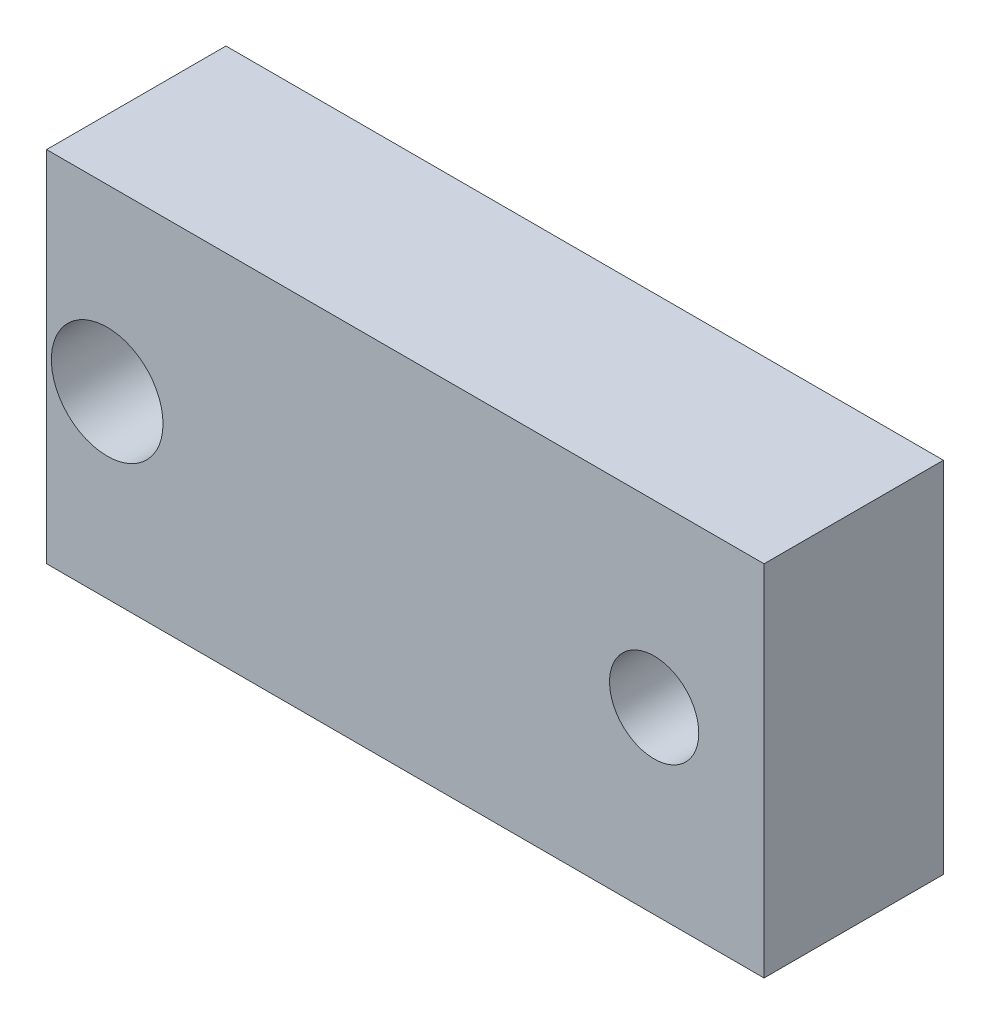
ISO-10303-21;
HEADER;
FILE_DESCRIPTION(('STEP AP214'),'2;1');
FILE_NAME('part.step','',(''),(''),'','','');
FILE_SCHEMA(('AUTOMOTIVE_DESIGN { 1 0 10303 214 1 1 1 1 }'));
ENDSEC;
DATA;
#1=APPLICATION_CONTEXT('core data for automotive mechanical design processes');
#2=APPLICATION_PROTOCOL_DEFINITION('international standard','automotive_design',2000,#1);
#3=PRODUCT_CONTEXT('',#1,'mechanical');
#4=PRODUCT('Part','Part','',(#3));
#5=PRODUCT_RELATED_PRODUCT_CATEGORY('part','',(#4));
#6=PRODUCT_DEFINITION_FORMATION('','',#4);
#7=PRODUCT_DEFINITION_CONTEXT('part definition',#1,'design');
#8=PRODUCT_DEFINITION('design','',#6,#7);
#9=PRODUCT_DEFINITION_SHAPE('','',#8);
#10=(LENGTH_UNIT() NAMED_UNIT(*) SI_UNIT(.MILLI.,.METRE.));
#11=(NAMED_UNIT(*) PLANE_ANGLE_UNIT() SI_UNIT($,.RADIAN.));
#12=(NAMED_UNIT(*) SI_UNIT($,.STERADIAN.) SOLID_ANGLE_UNIT());
#13=UNCERTAINTY_MEASURE_WITH_UNIT(LENGTH_MEASURE(1.E-05),#10,'distance_accuracy_value','');
#14=(GEOMETRIC_REPRESENTATION_CONTEXT(3) GLOBAL_UNCERTAINTY_ASSIGNED_CONTEXT((#13)) GLOBAL_UNIT_ASSIGNED_CONTEXT((#10,
#11,#12)) REPRESENTATION_CONTEXT('',''));
#15=CARTESIAN_POINT('',(0.,0.,0.));
#16=DIRECTION('',(0.,0.,1.));
#17=DIRECTION('',(1.,0.,0.));
#18=AXIS2_PLACEMENT_3D('',#15,#16,#17);
#19=CARTESIAN_POINT('',(0.,0.,6.35));
#20=DIRECTION('',(0.,0.,-1.));
#21=DIRECTION('',(-1.,0.,0.));
#22=AXIS2_PLACEMENT_3D('',#19,#20,#21);
#23=PLANE('',#22);
#24=DIRECTION('',(0.,1.,0.));
#25=VECTOR('',#24,1.);
#26=CARTESIAN_POINT('',(12.7,-6.35,6.35));
#27=LINE('',#26,#25);
#28=CARTESIAN_POINT('',(12.7,-6.35,6.35));
#29=VERTEX_POINT('',#28);
#30=CARTESIAN_POINT('',(12.7,6.35,6.35));
#31=VERTEX_POINT('',#30);
#32=EDGE_CURVE('E96',#29,#31,#27,.T.);
#33=ORIENTED_EDGE('',*,*,#32,.T.);
#34=DIRECTION('',(-1.,0.,0.));
#35=VECTOR('',#34,1.);
#36=CARTESIAN_POINT('',(-12.7,6.35,6.35));
#37=LINE('',#36,#35);
#38=CARTESIAN_POINT('',(-12.7,6.35,6.35));
#39=VERTEX_POINT('',#38);
#40=EDGE_CURVE('E91',#31,#39,#37,.T.);
#41=ORIENTED_EDGE('',*,*,#40,.T.);
#42=DIRECTION('',(0.,-1.,0.));
#43=VECTOR('',#42,1.);
#44=CARTESIAN_POINT('',(-12.7,-6.35,6.35));
#45=LINE('',#44,#43);
#46=CARTESIAN_POINT('',(-12.7,-6.35,6.35));
#47=VERTEX_POINT('',#46);
#48=EDGE_CURVE('E94',#39,#47,#45,.T.);
#49=ORIENTED_EDGE('',*,*,#48,.T.);
#50=DIRECTION('',(1.,0.,0.));
#51=VECTOR('',#50,1.);
#52=CARTESIAN_POINT('',(-12.7,-6.35,6.35));
#53=LINE('',#52,#51);
#54=EDGE_CURVE('E61',#47,#29,#53,.T.);
#55=ORIENTED_EDGE('',*,*,#54,.T.);
#56=EDGE_LOOP('',(#33,#41,#49,#55));
#57=FACE_BOUND('',#56,.T.);
#58=CARTESIAN_POINT('',(-10.5551832513173,0.,6.35));
#59=DIRECTION('',(0.,0.,1.));
#60=DIRECTION('',(1.,0.,0.));
#61=AXIS2_PLACEMENT_3D('',#58,#59,#60);
#62=CIRCLE('',#61,1.97613137361897);
#63=CARTESIAN_POINT('',(-8.57905187769831,0.,6.35));
#64=VERTEX_POINT('',#63);
#65=EDGE_CURVE('E116',#64,#64,#62,.T.);
#66=ORIENTED_EDGE('',*,*,#65,.F.);
#67=EDGE_LOOP('',(#66));
#68=FACE_BOUND('',#67,.T.);
#69=CARTESIAN_POINT('',(8.80921308944525,0.,6.35));
#70=DIRECTION('',(0.,0.,1.));
#71=DIRECTION('',(1.,0.,0.));
#72=AXIS2_PLACEMENT_3D('',#69,#70,#71);
#73=CIRCLE('',#72,1.57931997319352);
#74=CARTESIAN_POINT('',(10.3885330626388,0.,6.35));
#75=VERTEX_POINT('',#74);
#76=EDGE_CURVE('E138',#75,#75,#73,.T.);
#77=ORIENTED_EDGE('',*,*,#76,.F.);
#78=EDGE_LOOP('',(#77));
#79=FACE_BOUND('',#78,.T.);
#80=ADVANCED_FACE('F43',(#57,#68,#79),#23,.F.);
#81=CARTESIAN_POINT('',(0.,0.,0.));
#82=DIRECTION('',(0.,0.,-1.));
#83=DIRECTION('',(-1.,0.,0.));
#84=AXIS2_PLACEMENT_3D('',#81,#82,#83);
#85=PLANE('',#84);
#86=CARTESIAN_POINT('',(-10.5551832513173,0.,0.));
#87=DIRECTION('',(0.,0.,1.));
#88=DIRECTION('',(1.,0.,0.));
#89=AXIS2_PLACEMENT_3D('',#86,#87,#88);
#90=CIRCLE('',#89,1.97613137361897);
#91=CARTESIAN_POINT('',(-8.57905187769831,0.,0.));
#92=VERTEX_POINT('',#91);
#93=EDGE_CURVE('E134',#92,#92,#90,.T.);
#94=ORIENTED_EDGE('',*,*,#93,.T.);
#95=EDGE_LOOP('',(#94));
#96=FACE_BOUND('',#95,.T.);
#97=DIRECTION('',(0.,1.,0.));
#98=VECTOR('',#97,1.);
#99=CARTESIAN_POINT('',(12.7,-6.35,0.));
#100=LINE('',#99,#98);
#101=CARTESIAN_POINT('',(12.7,-6.35,0.));
#102=VERTEX_POINT('',#101);
#103=CARTESIAN_POINT('',(12.7,6.35,0.));
#104=VERTEX_POINT('',#103);
#105=EDGE_CURVE('E112',#102,#104,#100,.T.);
#106=ORIENTED_EDGE('',*,*,#105,.F.);
#107=DIRECTION('',(1.,0.,0.));
#108=VECTOR('',#107,1.);
#109=CARTESIAN_POINT('',(-12.7,-6.35,0.));
#110=LINE('',#109,#108);
#111=CARTESIAN_POINT('',(-12.7,-6.35,0.));
#112=VERTEX_POINT('',#111);
#113=EDGE_CURVE('E84',#112,#102,#110,.T.);
#114=ORIENTED_EDGE('',*,*,#113,.F.);
#115=DIRECTION('',(0.,-1.,0.));
#116=VECTOR('',#115,1.);
#117=CARTESIAN_POINT('',(-12.7,-6.35,0.));
#118=LINE('',#117,#116);
#119=CARTESIAN_POINT('',(-12.7,6.35,0.));
#120=VERTEX_POINT('',#119);
#121=EDGE_CURVE('E78',#120,#112,#118,.T.);
#122=ORIENTED_EDGE('',*,*,#121,.F.);
#123=DIRECTION('',(-1.,0.,0.));
#124=VECTOR('',#123,1.);
#125=CARTESIAN_POINT('',(-12.7,6.35,0.));
#126=LINE('',#125,#124);
#127=EDGE_CURVE('E101',#104,#120,#126,.T.);
#128=ORIENTED_EDGE('',*,*,#127,.F.);
#129=EDGE_LOOP('',(#106,#114,#122,#128));
#130=FACE_BOUND('',#129,.T.);
#131=CARTESIAN_POINT('',(8.80921308944525,0.,0.));
#132=DIRECTION('',(0.,0.,1.));
#133=DIRECTION('',(1.,0.,0.));
#134=AXIS2_PLACEMENT_3D('',#131,#132,#133);
#135=CIRCLE('',#134,1.57931997319352);
#136=CARTESIAN_POINT('',(10.3885330626388,0.,0.));
#137=VERTEX_POINT('',#136);
#138=EDGE_CURVE('E142',#137,#137,#135,.T.);
#139=ORIENTED_EDGE('',*,*,#138,.T.);
#140=EDGE_LOOP('',(#139));
#141=FACE_BOUND('',#140,.T.);
#142=ADVANCED_FACE('F129',(#96,#130,#141),#85,.T.);
#143=CARTESIAN_POINT('',(12.7,-6.35,6.35));
#144=DIRECTION('',(-1.,0.,0.));
#145=DIRECTION('',(0.,0.,1.));
#146=AXIS2_PLACEMENT_3D('',#143,#144,#145);
#147=PLANE('',#146);
#148=ORIENTED_EDGE('',*,*,#105,.T.);
#149=DIRECTION('',(0.,0.,-1.));
#150=VECTOR('',#149,1.);
#151=CARTESIAN_POINT('',(12.7,6.35,6.35));
#152=LINE('',#151,#150);
#153=EDGE_CURVE('E11',#31,#104,#152,.T.);
#154=ORIENTED_EDGE('',*,*,#153,.F.);
#155=ORIENTED_EDGE('',*,*,#32,.F.);
#156=DIRECTION('',(0.,0.,-1.));
#157=VECTOR('',#156,1.);
#158=CARTESIAN_POINT('',(12.7,-6.35,6.35));
#159=LINE('',#158,#157);
#160=EDGE_CURVE('E108',#29,#102,#159,.T.);
#161=ORIENTED_EDGE('',*,*,#160,.T.);
#162=EDGE_LOOP('',(#148,#154,#155,#161));
#163=FACE_BOUND('',#162,.T.);
#164=ADVANCED_FACE('F45',(#163),#147,.F.);
#165=CARTESIAN_POINT('',(-12.7,6.35,6.35));
#166=DIRECTION('',(0.,-1.,0.));
#167=DIRECTION('',(0.,0.,-1.));
#168=AXIS2_PLACEMENT_3D('',#165,#166,#167);
#169=PLANE('',#168);
#170=ORIENTED_EDGE('',*,*,#127,.T.);
#171=DIRECTION('',(0.,0.,-1.));
#172=VECTOR('',#171,1.);
#173=CARTESIAN_POINT('',(-12.7,6.35,6.35));
#174=LINE('',#173,#172);
#175=EDGE_CURVE('E53',#39,#120,#174,.T.);
#176=ORIENTED_EDGE('',*,*,#175,.F.);
#177=ORIENTED_EDGE('',*,*,#40,.F.);
#178=ORIENTED_EDGE('',*,*,#153,.T.);
#179=EDGE_LOOP('',(#170,#176,#177,#178));
#180=FACE_BOUND('',#179,.T.);
#181=ADVANCED_FACE('F100',(#180),#169,.F.);
#182=CARTESIAN_POINT('',(-12.7,-6.35,6.35));
#183=DIRECTION('',(1.,0.,0.));
#184=DIRECTION('',(0.,0.,-1.));
#185=AXIS2_PLACEMENT_3D('',#182,#183,#184);
#186=PLANE('',#185);
#187=ORIENTED_EDGE('',*,*,#121,.T.);
#188=DIRECTION('',(0.,0.,-1.));
#189=VECTOR('',#188,1.);
#190=CARTESIAN_POINT('',(-12.7,-6.35,6.35));
#191=LINE('',#190,#189);
#192=EDGE_CURVE('E103',#47,#112,#191,.T.);
#193=ORIENTED_EDGE('',*,*,#192,.F.);
#194=ORIENTED_EDGE('',*,*,#48,.F.);
#195=ORIENTED_EDGE('',*,*,#175,.T.);
#196=EDGE_LOOP('',(#187,#193,#194,#195));
#197=FACE_BOUND('',#196,.T.);
#198=ADVANCED_FACE('F104',(#197),#186,.F.);
#199=CARTESIAN_POINT('',(-12.7,-6.35,6.35));
#200=DIRECTION('',(0.,1.,0.));
#201=DIRECTION('',(0.,0.,1.));
#202=AXIS2_PLACEMENT_3D('',#199,#200,#201);
#203=PLANE('',#202);
#204=ORIENTED_EDGE('',*,*,#113,.T.);
#205=ORIENTED_EDGE('',*,*,#160,.F.);
#206=ORIENTED_EDGE('',*,*,#54,.F.);
#207=ORIENTED_EDGE('',*,*,#192,.T.);
#208=EDGE_LOOP('',(#204,#205,#206,#207));
#209=FACE_BOUND('',#208,.T.);
#210=ADVANCED_FACE('F126',(#209),#203,.F.);
#211=CARTESIAN_POINT('',(-10.5551832513173,0.,6.35));
#212=DIRECTION('',(0.,0.,-1.));
#213=DIRECTION('',(-1.,0.,0.));
#214=AXIS2_PLACEMENT_3D('',#211,#212,#213);
#215=CYLINDRICAL_SURFACE('',#214,1.97613137361897);
#216=ORIENTED_EDGE('',*,*,#65,.T.);
#217=EDGE_LOOP('',(#216));
#218=FACE_BOUND('',#217,.T.);
#219=ORIENTED_EDGE('',*,*,#93,.F.);
#220=EDGE_LOOP('',(#219));
#221=FACE_BOUND('',#220,.T.);
#222=ADVANCED_FACE('F161',(#218,#221),#215,.F.);
#223=CARTESIAN_POINT('',(8.80921308944525,0.,6.35));
#224=DIRECTION('',(0.,0.,-1.));
#225=DIRECTION('',(-1.,0.,0.));
#226=AXIS2_PLACEMENT_3D('',#223,#224,#225);
#227=CYLINDRICAL_SURFACE('',#226,1.57931997319352);
#228=ORIENTED_EDGE('',*,*,#76,.T.);
#229=EDGE_LOOP('',(#228));
#230=FACE_BOUND('',#229,.T.);
#231=ORIENTED_EDGE('',*,*,#138,.F.);
#232=EDGE_LOOP('',(#231));
#233=FACE_BOUND('',#232,.T.);
#234=ADVANCED_FACE('F150',(#230,#233),#227,.F.);
#235=CLOSED_SHELL('',(#80,#142,#164,#181,#198,#210,#222,#234));
#236=MANIFOLD_SOLID_BREP('B2',#235);
#237=ADVANCED_BREP_SHAPE_REPRESENTATION('',(#18,#236),#14);
#238=SHAPE_DEFINITION_REPRESENTATION(#9,#237);
ENDSEC;
END-ISO-10303-21;
